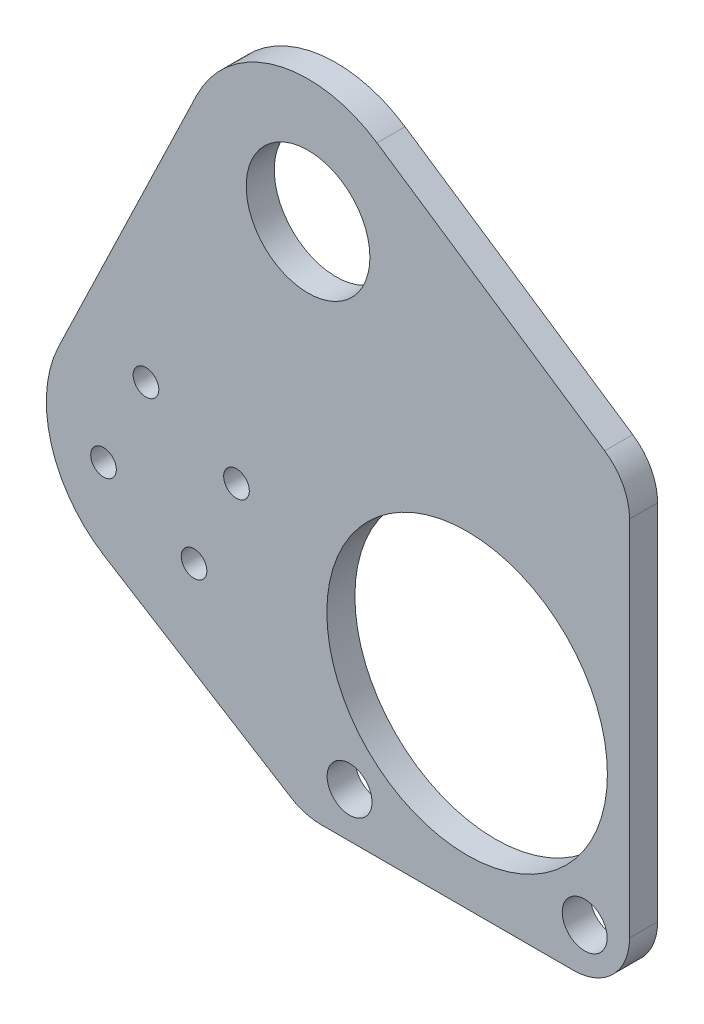
ISO-10303-21;
HEADER;
FILE_DESCRIPTION(('STEP AP214'),'2;1');
FILE_NAME('part.step','',(''),(''),'','','');
FILE_SCHEMA(('AUTOMOTIVE_DESIGN { 1 0 10303 214 1 1 1 1 }'));
ENDSEC;
DATA;
#1=APPLICATION_CONTEXT('core data for automotive mechanical design processes');
#2=APPLICATION_PROTOCOL_DEFINITION('international standard','automotive_design',2000,#1);
#3=PRODUCT_CONTEXT('',#1,'mechanical');
#4=PRODUCT('Part','Part','',(#3));
#5=PRODUCT_RELATED_PRODUCT_CATEGORY('part','',(#4));
#6=PRODUCT_DEFINITION_FORMATION('','',#4);
#7=PRODUCT_DEFINITION_CONTEXT('part definition',#1,'design');
#8=PRODUCT_DEFINITION('design','',#6,#7);
#9=PRODUCT_DEFINITION_SHAPE('','',#8);
#10=(LENGTH_UNIT() NAMED_UNIT(*) SI_UNIT(.MILLI.,.METRE.));
#11=(NAMED_UNIT(*) PLANE_ANGLE_UNIT() SI_UNIT($,.RADIAN.));
#12=(NAMED_UNIT(*) SI_UNIT($,.STERADIAN.) SOLID_ANGLE_UNIT());
#13=UNCERTAINTY_MEASURE_WITH_UNIT(LENGTH_MEASURE(1.E-05),#10,'distance_accuracy_value','');
#14=(GEOMETRIC_REPRESENTATION_CONTEXT(3) GLOBAL_UNCERTAINTY_ASSIGNED_CONTEXT((#13)) GLOBAL_UNIT_ASSIGNED_CONTEXT((#10,
#11,#12)) REPRESENTATION_CONTEXT('',''));
#15=CARTESIAN_POINT('',(0.,0.,0.));
#16=DIRECTION('',(0.,0.,1.));
#17=DIRECTION('',(1.,0.,0.));
#18=AXIS2_PLACEMENT_3D('',#15,#16,#17);
#19=CARTESIAN_POINT('',(-18.,37.1981030316258,3.175));
#20=DIRECTION('',(0.,0.,-1.));
#21=DIRECTION('',(-1.,0.,0.));
#22=AXIS2_PLACEMENT_3D('',#19,#20,#21);
#23=PLANE('',#22);
#24=CARTESIAN_POINT('',(-36.3433566437864,12.288243337193,3.175));
#25=DIRECTION('',(0.,0.,-1.));
#26=DIRECTION('',(-1.,0.,0.));
#27=AXIS2_PLACEMENT_3D('',#24,#25,#26);
#28=CIRCLE('',#27,1.44999999999999);
#29=CARTESIAN_POINT('',(-37.7933566437864,12.288243337193,3.175));
#30=VERTEX_POINT('',#29);
#31=EDGE_CURVE('E278',#30,#30,#28,.T.);
#32=ORIENTED_EDGE('',*,*,#31,.T.);
#33=EDGE_LOOP('',(#32));
#34=FACE_BOUND('',#33,.T.);
#35=CARTESIAN_POINT('',(-41.1466149284365,2.04477176497003,3.175));
#36=DIRECTION('',(0.,0.,-1.));
#37=DIRECTION('',(-1.,0.,0.));
#38=AXIS2_PLACEMENT_3D('',#35,#36,#37);
#39=CIRCLE('',#38,1.44999999999999);
#40=CARTESIAN_POINT('',(-42.5966149284365,2.04477176497003,3.175));
#41=VERTEX_POINT('',#40);
#42=EDGE_CURVE('E288',#41,#41,#39,.T.);
#43=ORIENTED_EDGE('',*,*,#42,.T.);
#44=EDGE_LOOP('',(#43));
#45=FACE_BOUND('',#44,.T.);
#46=CARTESIAN_POINT('',(-30.9031433562136,-2.75848651968011,3.175));
#47=DIRECTION('',(0.,0.,-1.));
#48=DIRECTION('',(-1.,0.,0.));
#49=AXIS2_PLACEMENT_3D('',#46,#47,#48);
#50=CIRCLE('',#49,1.44999999999999);
#51=CARTESIAN_POINT('',(-32.3531433562136,-2.75848651968011,3.175));
#52=VERTEX_POINT('',#51);
#53=EDGE_CURVE('E294',#52,#52,#50,.T.);
#54=ORIENTED_EDGE('',*,*,#53,.T.);
#55=EDGE_LOOP('',(#54));
#56=FACE_BOUND('',#55,.T.);
#57=CARTESIAN_POINT('',(-26.0998850715635,7.48498505254285,3.175));
#58=DIRECTION('',(0.,0.,-1.));
#59=DIRECTION('',(-1.,0.,0.));
#60=AXIS2_PLACEMENT_3D('',#57,#58,#59);
#61=CIRCLE('',#60,1.44999999999999);
#62=CARTESIAN_POINT('',(-27.5498850715634,7.48498505254285,3.175));
#63=VERTEX_POINT('',#62);
#64=EDGE_CURVE('E300',#63,#63,#61,.T.);
#65=ORIENTED_EDGE('',*,*,#64,.T.);
#66=EDGE_LOOP('',(#65));
#67=FACE_BOUND('',#66,.T.);
#68=DIRECTION('',(0.849720395267049,-0.527233581884927,0.));
#69=VECTOR('',#68,1.);
#70=CARTESIAN_POINT('',(-41.0018839784796,-7.12695852300591,3.175));
#71=LINE('',#70,#69);
#72=CARTESIAN_POINT('',(-41.0018839784796,-7.12695852300591,3.175));
#73=VERTEX_POINT('',#72);
#74=CARTESIAN_POINT('',(-19.921216044772,-20.2070683157364,3.175));
#75=VERTEX_POINT('',#74);
#76=EDGE_CURVE('E146',#73,#75,#71,.T.);
#77=ORIENTED_EDGE('',*,*,#76,.T.);
#78=CARTESIAN_POINT('',(-16.5732827998027,-14.8113438057907,3.175));
#79=DIRECTION('',(0.,0.,-1.));
#80=DIRECTION('',(-1.,0.,0.));
#81=AXIS2_PLACEMENT_3D('',#78,#79,#80);
#82=CIRCLE('',#81,6.35);
#83=CARTESIAN_POINT('',(-16.5732827998027,-21.1613438057907,3.175));
#84=VERTEX_POINT('',#83);
#85=EDGE_CURVE('E189',#75,#84,#82,.F.);
#86=ORIENTED_EDGE('',*,*,#85,.T.);
#87=DIRECTION('',(1.,0.,0.));
#88=VECTOR('',#87,1.);
#89=CARTESIAN_POINT('',(18.38325,-21.1613438057907,3.175));
#90=LINE('',#89,#88);
#91=CARTESIAN_POINT('',(12.03325,-21.1613438057907,3.175));
#92=VERTEX_POINT('',#91);
#93=EDGE_CURVE('E148',#84,#92,#90,.T.);
#94=ORIENTED_EDGE('',*,*,#93,.T.);
#95=CARTESIAN_POINT('',(12.03325,-14.8113438057907,3.175));
#96=DIRECTION('',(0.,0.,-1.));
#97=DIRECTION('',(-1.,0.,0.));
#98=AXIS2_PLACEMENT_3D('',#95,#96,#97);
#99=CIRCLE('',#98,6.35);
#100=CARTESIAN_POINT('',(18.38325,-14.8113438057907,3.175));
#101=VERTEX_POINT('',#100);
#102=EDGE_CURVE('E187',#92,#101,#99,.F.);
#103=ORIENTED_EDGE('',*,*,#102,.T.);
#104=DIRECTION('',(0.,1.,0.));
#105=VECTOR('',#104,1.);
#106=CARTESIAN_POINT('',(18.38325,-21.1613438057907,3.175));
#107=LINE('',#106,#105);
#108=CARTESIAN_POINT('',(18.38325,26.2524481981256,3.175));
#109=VERTEX_POINT('',#108);
#110=EDGE_CURVE('E124',#101,#109,#107,.T.);
#111=ORIENTED_EDGE('',*,*,#110,.T.);
#112=CARTESIAN_POINT('',(12.03325,26.2524481981256,3.175));
#113=DIRECTION('',(0.,0.,-1.));
#114=DIRECTION('',(-1.,0.,0.));
#115=AXIS2_PLACEMENT_3D('',#112,#113,#114);
#116=CIRCLE('',#115,6.35);
#117=CARTESIAN_POINT('',(15.5713863494175,31.5254066820254,3.175));
#118=VERTEX_POINT('',#117);
#119=EDGE_CURVE('E54',#109,#118,#116,.F.);
#120=ORIENTED_EDGE('',*,*,#119,.T.);
#121=DIRECTION('',(-0.830387162818862,0.557186826679922,0.));
#122=VECTOR('',#121,1.);
#123=CARTESIAN_POINT('',(-10.2021703606145,48.8193713752758,3.175));
#124=LINE('',#123,#122);
#125=CARTESIAN_POINT('',(-10.2021703606145,48.8193713752758,3.175));
#126=VERTEX_POINT('',#125);
#127=EDGE_CURVE('E115',#118,#126,#124,.T.);
#128=ORIENTED_EDGE('',*,*,#127,.T.);
#129=CARTESIAN_POINT('',(-18.,37.1981030316258,3.175));
#130=DIRECTION('',(0.,0.,1.));
#131=DIRECTION('',(-1.,0.,0.));
#132=AXIS2_PLACEMENT_3D('',#129,#130,#131);
#133=CIRCLE('',#132,13.995);
#134=CARTESIAN_POINT('',(-30.6084160721405,43.2716414691258,3.175));
#135=VERTEX_POINT('',#134);
#136=EDGE_CURVE('E120',#126,#135,#133,.T.);
#137=ORIENTED_EDGE('',*,*,#136,.T.);
#138=DIRECTION('',(-0.433979166666667,-0.900922906190816,0.));
#139=VECTOR('',#138,1.);
#140=CARTESIAN_POINT('',(-46.2316660721405,10.8384168462564,3.175));
#141=LINE('',#140,#139);
#142=CARTESIAN_POINT('',(-46.2316660721405,10.8384168462564,3.175));
#143=VERTEX_POINT('',#142);
#144=EDGE_CURVE('E139',#135,#143,#141,.T.);
#145=ORIENTED_EDGE('',*,*,#144,.T.);
#146=CARTESIAN_POINT('',(-33.62325,4.76487840875644,3.175));
#147=DIRECTION('',(0.,0.,1.));
#148=DIRECTION('',(1.,0.,0.));
#149=AXIS2_PLACEMENT_3D('',#146,#147,#148);
#150=CIRCLE('',#149,13.995);
#151=EDGE_CURVE('E141',#143,#73,#150,.T.);
#152=ORIENTED_EDGE('',*,*,#151,.T.);
#153=EDGE_LOOP('',(#77,#86,#94,#103,#111,#120,#128,#137,#145,#152));
#154=FACE_BOUND('',#153,.T.);
#155=CARTESIAN_POINT('',(-13.30325,-16.0813438057907,3.175));
#156=DIRECTION('',(0.,0.,1.));
#157=DIRECTION('',(1.,0.,0.));
#158=AXIS2_PLACEMENT_3D('',#155,#156,#157);
#159=CIRCLE('',#158,2.54);
#160=CARTESIAN_POINT('',(-10.76325,-16.0813438057907,3.175));
#161=VERTEX_POINT('',#160);
#162=EDGE_CURVE('E154',#161,#161,#159,.T.);
#163=ORIENTED_EDGE('',*,*,#162,.F.);
#164=EDGE_LOOP('',(#163));
#165=FACE_BOUND('',#164,.T.);
#166=CARTESIAN_POINT('',(13.30325,-16.0813438057907,3.175));
#167=DIRECTION('',(0.,0.,1.));
#168=DIRECTION('',(-1.,0.,0.));
#169=AXIS2_PLACEMENT_3D('',#166,#167,#168);
#170=CIRCLE('',#169,2.54);
#171=CARTESIAN_POINT('',(10.76325,-16.0813438057907,3.175));
#172=VERTEX_POINT('',#171);
#173=EDGE_CURVE('E316',#172,#172,#170,.T.);
#174=ORIENTED_EDGE('',*,*,#173,.F.);
#175=EDGE_LOOP('',(#174));
#176=FACE_BOUND('',#175,.T.);
#177=CARTESIAN_POINT('',(0.,-0.0196469683741742,3.175));
#178=DIRECTION('',(0.,0.,1.));
#179=DIRECTION('',(1.,0.,0.));
#180=AXIS2_PLACEMENT_3D('',#177,#178,#179);
#181=CIRCLE('',#180,15.875);
#182=CARTESIAN_POINT('',(15.875,-0.0196469683741742,3.175));
#183=VERTEX_POINT('',#182);
#184=EDGE_CURVE('E310',#183,#183,#181,.T.);
#185=ORIENTED_EDGE('',*,*,#184,.F.);
#186=EDGE_LOOP('',(#185));
#187=FACE_BOUND('',#186,.T.);
#188=CARTESIAN_POINT('',(-18.,37.1981030316258,3.175));
#189=DIRECTION('',(0.,0.,1.));
#190=DIRECTION('',(1.,0.,0.));
#191=AXIS2_PLACEMENT_3D('',#188,#189,#190);
#192=CIRCLE('',#191,7.);
#193=CARTESIAN_POINT('',(-11.,37.1981030316258,3.175));
#194=VERTEX_POINT('',#193);
#195=EDGE_CURVE('E304',#194,#194,#192,.T.);
#196=ORIENTED_EDGE('',*,*,#195,.F.);
#197=EDGE_LOOP('',(#196));
#198=FACE_BOUND('',#197,.T.);
#199=ADVANCED_FACE('F39',(#34,#45,#56,#67,#154,#165,#176,#187,#198),#23,.F.);
#200=CARTESIAN_POINT('',(18.38325,-21.1613438057907,3.175));
#201=DIRECTION('',(-1.,0.,0.));
#202=DIRECTION('',(0.,0.,1.));
#203=AXIS2_PLACEMENT_3D('',#200,#201,#202);
#204=PLANE('',#203);
#205=ORIENTED_EDGE('',*,*,#110,.F.);
#206=DIRECTION('',(0.,0.,-1.));
#207=VECTOR('',#206,1.);
#208=CARTESIAN_POINT('',(18.38325,-14.8113438057907,3.175));
#209=LINE('',#208,#207);
#210=CARTESIAN_POINT('',(18.38325,-14.8113438057907,0.));
#211=VERTEX_POINT('',#210);
#212=EDGE_CURVE('E47',#101,#211,#209,.T.);
#213=ORIENTED_EDGE('',*,*,#212,.T.);
#214=DIRECTION('',(0.,1.,0.));
#215=VECTOR('',#214,1.);
#216=CARTESIAN_POINT('',(18.38325,-21.1613438057907,0.));
#217=LINE('',#216,#215);
#218=CARTESIAN_POINT('',(18.38325,26.2524481981256,0.));
#219=VERTEX_POINT('',#218);
#220=EDGE_CURVE('E152',#211,#219,#217,.T.);
#221=ORIENTED_EDGE('',*,*,#220,.T.);
#222=DIRECTION('',(0.,0.,-1.));
#223=VECTOR('',#222,1.);
#224=CARTESIAN_POINT('',(18.38325,26.2524481981256,3.175));
#225=LINE('',#224,#223);
#226=EDGE_CURVE('E62',#219,#109,#225,.F.);
#227=ORIENTED_EDGE('',*,*,#226,.T.);
#228=EDGE_LOOP('',(#205,#213,#221,#227));
#229=FACE_BOUND('',#228,.T.);
#230=ADVANCED_FACE('F194',(#229),#204,.F.);
#231=CARTESIAN_POINT('',(-10.2021703606145,48.8193713752758,3.175));
#232=DIRECTION('',(-0.557186826679922,-0.830387162818862,0.));
#233=DIRECTION('',(0.830387162818862,-0.557186826679922,0.));
#234=AXIS2_PLACEMENT_3D('',#231,#232,#233);
#235=PLANE('',#234);
#236=ORIENTED_EDGE('',*,*,#127,.F.);
#237=DIRECTION('',(0.,0.,-1.));
#238=VECTOR('',#237,1.);
#239=CARTESIAN_POINT('',(15.5713863494175,31.5254066820254,3.175));
#240=LINE('',#239,#238);
#241=CARTESIAN_POINT('',(15.5713863494175,31.5254066820254,0.));
#242=VERTEX_POINT('',#241);
#243=EDGE_CURVE('E11',#118,#242,#240,.T.);
#244=ORIENTED_EDGE('',*,*,#243,.T.);
#245=DIRECTION('',(-0.830387162818862,0.557186826679922,0.));
#246=VECTOR('',#245,1.);
#247=CARTESIAN_POINT('',(-10.2021703606145,48.8193713752758,0.));
#248=LINE('',#247,#246);
#249=CARTESIAN_POINT('',(-10.2021703606145,48.8193713752758,0.));
#250=VERTEX_POINT('',#249);
#251=EDGE_CURVE('E130',#242,#250,#248,.T.);
#252=ORIENTED_EDGE('',*,*,#251,.T.);
#253=DIRECTION('',(0.,0.,-1.));
#254=VECTOR('',#253,1.);
#255=CARTESIAN_POINT('',(-10.2021703606145,48.8193713752758,3.175));
#256=LINE('',#255,#254);
#257=EDGE_CURVE('E127',#126,#250,#256,.T.);
#258=ORIENTED_EDGE('',*,*,#257,.F.);
#259=EDGE_LOOP('',(#236,#244,#252,#258));
#260=FACE_BOUND('',#259,.T.);
#261=ADVANCED_FACE('F128',(#260),#235,.F.);
#262=CARTESIAN_POINT('',(-18.,37.1981030316258,3.175));
#263=DIRECTION('',(0.,0.,-1.));
#264=DIRECTION('',(-1.,0.,0.));
#265=AXIS2_PLACEMENT_3D('',#262,#263,#264);
#266=CYLINDRICAL_SURFACE('',#265,13.995);
#267=CARTESIAN_POINT('',(-18.,37.1981030316258,0.));
#268=DIRECTION('',(0.,0.,1.));
#269=DIRECTION('',(-1.,0.,0.));
#270=AXIS2_PLACEMENT_3D('',#267,#268,#269);
#271=CIRCLE('',#270,13.995);
#272=CARTESIAN_POINT('',(-30.6084160721405,43.2716414691258,0.));
#273=VERTEX_POINT('',#272);
#274=EDGE_CURVE('E156',#250,#273,#271,.T.);
#275=ORIENTED_EDGE('',*,*,#274,.T.);
#276=DIRECTION('',(0.,0.,-1.));
#277=VECTOR('',#276,1.);
#278=CARTESIAN_POINT('',(-30.6084160721405,43.2716414691258,3.175));
#279=LINE('',#278,#277);
#280=EDGE_CURVE('E134',#135,#273,#279,.T.);
#281=ORIENTED_EDGE('',*,*,#280,.F.);
#282=ORIENTED_EDGE('',*,*,#136,.F.);
#283=ORIENTED_EDGE('',*,*,#257,.T.);
#284=EDGE_LOOP('',(#275,#281,#282,#283));
#285=FACE_BOUND('',#284,.T.);
#286=ADVANCED_FACE('F136',(#285),#266,.T.);
#287=CARTESIAN_POINT('',(-46.2316660721405,10.8384168462564,3.175));
#288=DIRECTION('',(0.900922906190816,-0.433979166666667,0.));
#289=DIRECTION('',(0.433979166666667,0.900922906190816,0.));
#290=AXIS2_PLACEMENT_3D('',#287,#288,#289);
#291=PLANE('',#290);
#292=DIRECTION('',(-0.433979166666667,-0.900922906190816,0.));
#293=VECTOR('',#292,1.);
#294=CARTESIAN_POINT('',(-46.2316660721405,10.8384168462564,0.));
#295=LINE('',#294,#293);
#296=CARTESIAN_POINT('',(-46.2316660721405,10.8384168462564,0.));
#297=VERTEX_POINT('',#296);
#298=EDGE_CURVE('E158',#273,#297,#295,.T.);
#299=ORIENTED_EDGE('',*,*,#298,.T.);
#300=DIRECTION('',(0.,0.,-1.));
#301=VECTOR('',#300,1.);
#302=CARTESIAN_POINT('',(-46.2316660721405,10.8384168462564,3.175));
#303=LINE('',#302,#301);
#304=EDGE_CURVE('E170',#143,#297,#303,.T.);
#305=ORIENTED_EDGE('',*,*,#304,.F.);
#306=ORIENTED_EDGE('',*,*,#144,.F.);
#307=ORIENTED_EDGE('',*,*,#280,.T.);
#308=EDGE_LOOP('',(#299,#305,#306,#307));
#309=FACE_BOUND('',#308,.T.);
#310=ADVANCED_FACE('F224',(#309),#291,.F.);
#311=CARTESIAN_POINT('',(-33.62325,4.76487840875644,3.175));
#312=DIRECTION('',(0.,0.,-1.));
#313=DIRECTION('',(-1.,0.,0.));
#314=AXIS2_PLACEMENT_3D('',#311,#312,#313);
#315=CYLINDRICAL_SURFACE('',#314,13.995);
#316=CARTESIAN_POINT('',(-33.62325,4.76487840875644,0.));
#317=DIRECTION('',(0.,0.,1.));
#318=DIRECTION('',(1.,0.,0.));
#319=AXIS2_PLACEMENT_3D('',#316,#317,#318);
#320=CIRCLE('',#319,13.995);
#321=CARTESIAN_POINT('',(-41.0018839784796,-7.12695852300591,0.));
#322=VERTEX_POINT('',#321);
#323=EDGE_CURVE('E160',#297,#322,#320,.T.);
#324=ORIENTED_EDGE('',*,*,#323,.T.);
#325=DIRECTION('',(0.,0.,-1.));
#326=VECTOR('',#325,1.);
#327=CARTESIAN_POINT('',(-41.0018839784796,-7.12695852300591,3.175));
#328=LINE('',#327,#326);
#329=EDGE_CURVE('E151',#73,#322,#328,.T.);
#330=ORIENTED_EDGE('',*,*,#329,.F.);
#331=ORIENTED_EDGE('',*,*,#151,.F.);
#332=ORIENTED_EDGE('',*,*,#304,.T.);
#333=EDGE_LOOP('',(#324,#330,#331,#332));
#334=FACE_BOUND('',#333,.T.);
#335=ADVANCED_FACE('F227',(#334),#315,.T.);
#336=CARTESIAN_POINT('',(-41.0018839784796,-7.12695852300591,3.175));
#337=DIRECTION('',(0.527233581884927,0.849720395267049,0.));
#338=DIRECTION('',(-0.849720395267049,0.527233581884927,0.));
#339=AXIS2_PLACEMENT_3D('',#336,#337,#338);
#340=PLANE('',#339);
#341=DIRECTION('',(0.849720395267049,-0.527233581884927,0.));
#342=VECTOR('',#341,1.);
#343=CARTESIAN_POINT('',(-41.0018839784796,-7.12695852300591,0.));
#344=LINE('',#343,#342);
#345=CARTESIAN_POINT('',(-19.921216044772,-20.2070683157364,0.));
#346=VERTEX_POINT('',#345);
#347=EDGE_CURVE('E162',#322,#346,#344,.T.);
#348=ORIENTED_EDGE('',*,*,#347,.T.);
#349=DIRECTION('',(0.,0.,-1.));
#350=VECTOR('',#349,1.);
#351=CARTESIAN_POINT('',(-19.921216044772,-20.2070683157364,3.175));
#352=LINE('',#351,#350);
#353=EDGE_CURVE('E184',#346,#75,#352,.F.);
#354=ORIENTED_EDGE('',*,*,#353,.T.);
#355=ORIENTED_EDGE('',*,*,#76,.F.);
#356=ORIENTED_EDGE('',*,*,#329,.T.);
#357=EDGE_LOOP('',(#348,#354,#355,#356));
#358=FACE_BOUND('',#357,.T.);
#359=ADVANCED_FACE('F231',(#358),#340,.F.);
#360=CARTESIAN_POINT('',(18.38325,-21.1613438057907,3.175));
#361=DIRECTION('',(0.,1.,0.));
#362=DIRECTION('',(0.,0.,1.));
#363=AXIS2_PLACEMENT_3D('',#360,#361,#362);
#364=PLANE('',#363);
#365=ORIENTED_EDGE('',*,*,#93,.F.);
#366=DIRECTION('',(0.,0.,-1.));
#367=VECTOR('',#366,1.);
#368=CARTESIAN_POINT('',(-16.5732827998027,-21.1613438057907,3.175));
#369=LINE('',#368,#367);
#370=CARTESIAN_POINT('',(-16.5732827998027,-21.1613438057907,0.));
#371=VERTEX_POINT('',#370);
#372=EDGE_CURVE('E175',#84,#371,#369,.T.);
#373=ORIENTED_EDGE('',*,*,#372,.T.);
#374=DIRECTION('',(1.,0.,0.));
#375=VECTOR('',#374,1.);
#376=CARTESIAN_POINT('',(18.38325,-21.1613438057907,0.));
#377=LINE('',#376,#375);
#378=CARTESIAN_POINT('',(12.03325,-21.1613438057907,0.));
#379=VERTEX_POINT('',#378);
#380=EDGE_CURVE('E165',#371,#379,#377,.T.);
#381=ORIENTED_EDGE('',*,*,#380,.T.);
#382=DIRECTION('',(0.,0.,-1.));
#383=VECTOR('',#382,1.);
#384=CARTESIAN_POINT('',(12.03325,-21.1613438057907,3.175));
#385=LINE('',#384,#383);
#386=EDGE_CURVE('E133',#379,#92,#385,.F.);
#387=ORIENTED_EDGE('',*,*,#386,.T.);
#388=EDGE_LOOP('',(#365,#373,#381,#387));
#389=FACE_BOUND('',#388,.T.);
#390=ADVANCED_FACE('F235',(#389),#364,.F.);
#391=CARTESIAN_POINT('',(-13.30325,-16.0813438057907,3.175));
#392=DIRECTION('',(0.,0.,-1.));
#393=DIRECTION('',(-1.,0.,0.));
#394=AXIS2_PLACEMENT_3D('',#391,#392,#393);
#395=CYLINDRICAL_SURFACE('',#394,2.54);
#396=ORIENTED_EDGE('',*,*,#162,.T.);
#397=EDGE_LOOP('',(#396));
#398=FACE_BOUND('',#397,.T.);
#399=CARTESIAN_POINT('',(-13.30325,-16.0813438057907,0.));
#400=DIRECTION('',(0.,0.,1.));
#401=DIRECTION('',(1.,0.,0.));
#402=AXIS2_PLACEMENT_3D('',#399,#400,#401);
#403=CIRCLE('',#402,2.54);
#404=CARTESIAN_POINT('',(-10.76325,-16.0813438057907,0.));
#405=VERTEX_POINT('',#404);
#406=EDGE_CURVE('E319',#405,#405,#403,.T.);
#407=ORIENTED_EDGE('',*,*,#406,.F.);
#408=EDGE_LOOP('',(#407));
#409=FACE_BOUND('',#408,.T.);
#410=ADVANCED_FACE('F238',(#398,#409),#395,.F.);
#411=CARTESIAN_POINT('',(13.30325,-16.0813438057907,3.175));
#412=DIRECTION('',(0.,0.,-1.));
#413=DIRECTION('',(-1.,0.,0.));
#414=AXIS2_PLACEMENT_3D('',#411,#412,#413);
#415=CYLINDRICAL_SURFACE('',#414,2.54);
#416=ORIENTED_EDGE('',*,*,#173,.T.);
#417=EDGE_LOOP('',(#416));
#418=FACE_BOUND('',#417,.T.);
#419=CARTESIAN_POINT('',(13.30325,-16.0813438057907,0.));
#420=DIRECTION('',(0.,0.,1.));
#421=DIRECTION('',(-1.,0.,0.));
#422=AXIS2_PLACEMENT_3D('',#419,#420,#421);
#423=CIRCLE('',#422,2.54);
#424=CARTESIAN_POINT('',(10.76325,-16.0813438057907,0.));
#425=VERTEX_POINT('',#424);
#426=EDGE_CURVE('E313',#425,#425,#423,.T.);
#427=ORIENTED_EDGE('',*,*,#426,.F.);
#428=EDGE_LOOP('',(#427));
#429=FACE_BOUND('',#428,.T.);
#430=ADVANCED_FACE('F246',(#418,#429),#415,.F.);
#431=CARTESIAN_POINT('',(0.,-0.0196469683741742,3.175));
#432=DIRECTION('',(0.,0.,-1.));
#433=DIRECTION('',(-1.,0.,0.));
#434=AXIS2_PLACEMENT_3D('',#431,#432,#433);
#435=CYLINDRICAL_SURFACE('',#434,15.875);
#436=ORIENTED_EDGE('',*,*,#184,.T.);
#437=EDGE_LOOP('',(#436));
#438=FACE_BOUND('',#437,.T.);
#439=CARTESIAN_POINT('',(0.,-0.0196469683741742,0.));
#440=DIRECTION('',(0.,0.,1.));
#441=DIRECTION('',(1.,0.,0.));
#442=AXIS2_PLACEMENT_3D('',#439,#440,#441);
#443=CIRCLE('',#442,15.875);
#444=CARTESIAN_POINT('',(15.875,-0.0196469683741742,0.));
#445=VERTEX_POINT('',#444);
#446=EDGE_CURVE('E307',#445,#445,#443,.T.);
#447=ORIENTED_EDGE('',*,*,#446,.F.);
#448=EDGE_LOOP('',(#447));
#449=FACE_BOUND('',#448,.T.);
#450=ADVANCED_FACE('F250',(#438,#449),#435,.F.);
#451=CARTESIAN_POINT('',(-18.,37.1981030316258,3.175));
#452=DIRECTION('',(0.,0.,-1.));
#453=DIRECTION('',(-1.,0.,0.));
#454=AXIS2_PLACEMENT_3D('',#451,#452,#453);
#455=CYLINDRICAL_SURFACE('',#454,7.);
#456=ORIENTED_EDGE('',*,*,#195,.T.);
#457=EDGE_LOOP('',(#456));
#458=FACE_BOUND('',#457,.T.);
#459=CARTESIAN_POINT('',(-18.,37.1981030316258,0.));
#460=DIRECTION('',(0.,0.,1.));
#461=DIRECTION('',(1.,0.,0.));
#462=AXIS2_PLACEMENT_3D('',#459,#460,#461);
#463=CIRCLE('',#462,7.);
#464=CARTESIAN_POINT('',(-11.,37.1981030316258,0.));
#465=VERTEX_POINT('',#464);
#466=EDGE_CURVE('E303',#465,#465,#463,.T.);
#467=ORIENTED_EDGE('',*,*,#466,.F.);
#468=EDGE_LOOP('',(#467));
#469=FACE_BOUND('',#468,.T.);
#470=ADVANCED_FACE('F254',(#458,#469),#455,.F.);
#471=CARTESIAN_POINT('',(-26.0998850715635,7.48498505254285,0.));
#472=DIRECTION('',(0.,0.,-1.));
#473=DIRECTION('',(-1.,0.,0.));
#474=AXIS2_PLACEMENT_3D('',#471,#472,#473);
#475=CYLINDRICAL_SURFACE('',#474,1.44999999999998);
#476=ORIENTED_EDGE('',*,*,#64,.F.);
#477=EDGE_LOOP('',(#476));
#478=FACE_BOUND('',#477,.T.);
#479=CARTESIAN_POINT('',(-26.0998850715635,7.48498505254285,0.));
#480=DIRECTION('',(0.,0.,-1.));
#481=DIRECTION('',(-1.,0.,0.));
#482=AXIS2_PLACEMENT_3D('',#479,#480,#481);
#483=CIRCLE('',#482,1.44999999999998);
#484=CARTESIAN_POINT('',(-27.5498850715634,7.48498505254285,0.));
#485=VERTEX_POINT('',#484);
#486=EDGE_CURVE('E297',#485,#485,#483,.T.);
#487=ORIENTED_EDGE('',*,*,#486,.T.);
#488=EDGE_LOOP('',(#487));
#489=FACE_BOUND('',#488,.T.);
#490=ADVANCED_FACE('F258',(#478,#489),#475,.F.);
#491=CARTESIAN_POINT('',(-30.9031433562136,-2.75848651968011,0.));
#492=DIRECTION('',(0.,0.,-1.));
#493=DIRECTION('',(-1.,0.,0.));
#494=AXIS2_PLACEMENT_3D('',#491,#492,#493);
#495=CYLINDRICAL_SURFACE('',#494,1.44999999999998);
#496=ORIENTED_EDGE('',*,*,#53,.F.);
#497=EDGE_LOOP('',(#496));
#498=FACE_BOUND('',#497,.T.);
#499=CARTESIAN_POINT('',(-30.9031433562136,-2.75848651968011,0.));
#500=DIRECTION('',(0.,0.,-1.));
#501=DIRECTION('',(-1.,0.,0.));
#502=AXIS2_PLACEMENT_3D('',#499,#500,#501);
#503=CIRCLE('',#502,1.44999999999998);
#504=CARTESIAN_POINT('',(-32.3531433562136,-2.75848651968011,0.));
#505=VERTEX_POINT('',#504);
#506=EDGE_CURVE('E291',#505,#505,#503,.T.);
#507=ORIENTED_EDGE('',*,*,#506,.T.);
#508=EDGE_LOOP('',(#507));
#509=FACE_BOUND('',#508,.T.);
#510=ADVANCED_FACE('F262',(#498,#509),#495,.F.);
#511=CARTESIAN_POINT('',(-41.1466149284365,2.04477176497003,0.));
#512=DIRECTION('',(0.,0.,-1.));
#513=DIRECTION('',(-1.,0.,0.));
#514=AXIS2_PLACEMENT_3D('',#511,#512,#513);
#515=CYLINDRICAL_SURFACE('',#514,1.44999999999998);
#516=ORIENTED_EDGE('',*,*,#42,.F.);
#517=EDGE_LOOP('',(#516));
#518=FACE_BOUND('',#517,.T.);
#519=CARTESIAN_POINT('',(-41.1466149284365,2.04477176497003,0.));
#520=DIRECTION('',(0.,0.,-1.));
#521=DIRECTION('',(-1.,0.,0.));
#522=AXIS2_PLACEMENT_3D('',#519,#520,#521);
#523=CIRCLE('',#522,1.44999999999997);
#524=CARTESIAN_POINT('',(-42.5966149284365,2.04477176497003,0.));
#525=VERTEX_POINT('',#524);
#526=EDGE_CURVE('E283',#525,#525,#523,.T.);
#527=ORIENTED_EDGE('',*,*,#526,.T.);
#528=EDGE_LOOP('',(#527));
#529=FACE_BOUND('',#528,.T.);
#530=ADVANCED_FACE('F266',(#518,#529),#515,.F.);
#531=CARTESIAN_POINT('',(-36.3433566437864,12.288243337193,0.));
#532=DIRECTION('',(0.,0.,-1.));
#533=DIRECTION('',(-1.,0.,0.));
#534=AXIS2_PLACEMENT_3D('',#531,#532,#533);
#535=CYLINDRICAL_SURFACE('',#534,1.44999999999998);
#536=ORIENTED_EDGE('',*,*,#31,.F.);
#537=EDGE_LOOP('',(#536));
#538=FACE_BOUND('',#537,.T.);
#539=CARTESIAN_POINT('',(-36.3433566437864,12.288243337193,0.));
#540=DIRECTION('',(0.,0.,-1.));
#541=DIRECTION('',(-1.,0.,0.));
#542=AXIS2_PLACEMENT_3D('',#539,#540,#541);
#543=CIRCLE('',#542,1.44999999999997);
#544=CARTESIAN_POINT('',(-37.7933566437864,12.288243337193,0.));
#545=VERTEX_POINT('',#544);
#546=EDGE_CURVE('E281',#545,#545,#543,.T.);
#547=ORIENTED_EDGE('',*,*,#546,.T.);
#548=EDGE_LOOP('',(#547));
#549=FACE_BOUND('',#548,.T.);
#550=ADVANCED_FACE('F214',(#538,#549),#535,.F.);
#551=CARTESIAN_POINT('',(-16.5732827998027,-14.8113438057907,3.175));
#552=DIRECTION('',(0.,0.,-1.));
#553=DIRECTION('',(-1.,0.,0.));
#554=AXIS2_PLACEMENT_3D('',#551,#552,#553);
#555=CYLINDRICAL_SURFACE('',#554,6.35);
#556=ORIENTED_EDGE('',*,*,#85,.F.);
#557=ORIENTED_EDGE('',*,*,#353,.F.);
#558=CARTESIAN_POINT('',(-16.5732827998027,-14.8113438057907,0.));
#559=DIRECTION('',(0.,0.,-1.));
#560=DIRECTION('',(-1.,0.,0.));
#561=AXIS2_PLACEMENT_3D('',#558,#559,#560);
#562=CIRCLE('',#561,6.35);
#563=EDGE_CURVE('E182',#371,#346,#562,.T.);
#564=ORIENTED_EDGE('',*,*,#563,.F.);
#565=ORIENTED_EDGE('',*,*,#372,.F.);
#566=EDGE_LOOP('',(#556,#557,#564,#565));
#567=FACE_BOUND('',#566,.T.);
#568=ADVANCED_FACE('F210',(#567),#555,.T.);
#569=CARTESIAN_POINT('',(12.03325,-14.8113438057907,3.175));
#570=DIRECTION('',(0.,0.,-1.));
#571=DIRECTION('',(-1.,0.,0.));
#572=AXIS2_PLACEMENT_3D('',#569,#570,#571);
#573=CYLINDRICAL_SURFACE('',#572,6.35);
#574=ORIENTED_EDGE('',*,*,#102,.F.);
#575=ORIENTED_EDGE('',*,*,#386,.F.);
#576=CARTESIAN_POINT('',(12.03325,-14.8113438057907,0.));
#577=DIRECTION('',(0.,0.,-1.));
#578=DIRECTION('',(-1.,0.,0.));
#579=AXIS2_PLACEMENT_3D('',#576,#577,#578);
#580=CIRCLE('',#579,6.35);
#581=EDGE_CURVE('E180',#211,#379,#580,.T.);
#582=ORIENTED_EDGE('',*,*,#581,.F.);
#583=ORIENTED_EDGE('',*,*,#212,.F.);
#584=EDGE_LOOP('',(#574,#575,#582,#583));
#585=FACE_BOUND('',#584,.T.);
#586=ADVANCED_FACE('F203',(#585),#573,.T.);
#587=CARTESIAN_POINT('',(12.03325,26.2524481981256,3.175));
#588=DIRECTION('',(0.,0.,-1.));
#589=DIRECTION('',(-1.,0.,0.));
#590=AXIS2_PLACEMENT_3D('',#587,#588,#589);
#591=CYLINDRICAL_SURFACE('',#590,6.35);
#592=ORIENTED_EDGE('',*,*,#119,.F.);
#593=ORIENTED_EDGE('',*,*,#226,.F.);
#594=CARTESIAN_POINT('',(12.03325,26.2524481981256,0.));
#595=DIRECTION('',(0.,0.,-1.));
#596=DIRECTION('',(-1.,0.,0.));
#597=AXIS2_PLACEMENT_3D('',#594,#595,#596);
#598=CIRCLE('',#597,6.35);
#599=EDGE_CURVE('E178',#242,#219,#598,.T.);
#600=ORIENTED_EDGE('',*,*,#599,.F.);
#601=ORIENTED_EDGE('',*,*,#243,.F.);
#602=EDGE_LOOP('',(#592,#593,#600,#601));
#603=FACE_BOUND('',#602,.T.);
#604=ADVANCED_FACE('F41',(#603),#591,.T.);
#605=CARTESIAN_POINT('',(-18.,37.1981030316258,0.));
#606=DIRECTION('',(0.,0.,-1.));
#607=DIRECTION('',(-1.,0.,0.));
#608=AXIS2_PLACEMENT_3D('',#605,#606,#607);
#609=PLANE('',#608);
#610=ORIENTED_EDGE('',*,*,#546,.F.);
#611=EDGE_LOOP('',(#610));
#612=FACE_BOUND('',#611,.T.);
#613=ORIENTED_EDGE('',*,*,#526,.F.);
#614=EDGE_LOOP('',(#613));
#615=FACE_BOUND('',#614,.T.);
#616=ORIENTED_EDGE('',*,*,#506,.F.);
#617=EDGE_LOOP('',(#616));
#618=FACE_BOUND('',#617,.T.);
#619=ORIENTED_EDGE('',*,*,#486,.F.);
#620=EDGE_LOOP('',(#619));
#621=FACE_BOUND('',#620,.T.);
#622=ORIENTED_EDGE('',*,*,#446,.T.);
#623=EDGE_LOOP('',(#622));
#624=FACE_BOUND('',#623,.T.);
#625=ORIENTED_EDGE('',*,*,#406,.T.);
#626=EDGE_LOOP('',(#625));
#627=FACE_BOUND('',#626,.T.);
#628=ORIENTED_EDGE('',*,*,#380,.F.);
#629=ORIENTED_EDGE('',*,*,#563,.T.);
#630=ORIENTED_EDGE('',*,*,#347,.F.);
#631=ORIENTED_EDGE('',*,*,#323,.F.);
#632=ORIENTED_EDGE('',*,*,#298,.F.);
#633=ORIENTED_EDGE('',*,*,#274,.F.);
#634=ORIENTED_EDGE('',*,*,#251,.F.);
#635=ORIENTED_EDGE('',*,*,#599,.T.);
#636=ORIENTED_EDGE('',*,*,#220,.F.);
#637=ORIENTED_EDGE('',*,*,#581,.T.);
#638=EDGE_LOOP('',(#628,#629,#630,#631,#632,#633,#634,#635,#636,#637));
#639=FACE_BOUND('',#638,.T.);
#640=ORIENTED_EDGE('',*,*,#426,.T.);
#641=EDGE_LOOP('',(#640));
#642=FACE_BOUND('',#641,.T.);
#643=ORIENTED_EDGE('',*,*,#466,.T.);
#644=EDGE_LOOP('',(#643));
#645=FACE_BOUND('',#644,.T.);
#646=ADVANCED_FACE('F199',(#612,#615,#618,#621,#624,#627,#639,#642,#645),#609,.T.);
#647=CLOSED_SHELL('',(#199,#230,#261,#286,#310,#335,#359,#390,#410,#430,#450,#470,#490,#510,
#530,#550,#568,#586,#604,#646));
#648=MANIFOLD_SOLID_BREP('B2',#647);
#649=ADVANCED_BREP_SHAPE_REPRESENTATION('',(#18,#648),#14);
#650=SHAPE_DEFINITION_REPRESENTATION(#9,#649);
ENDSEC;
END-ISO-10303-21;
